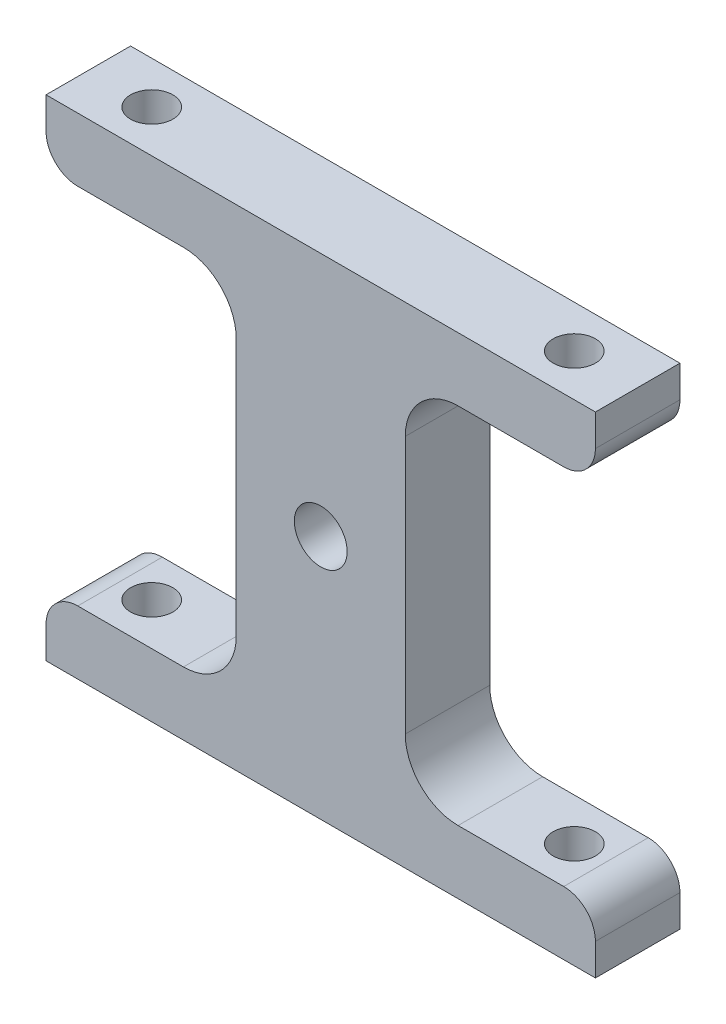
ISO-10303-21;
HEADER;
FILE_DESCRIPTION(('STEP AP214'),'2;1');
FILE_NAME('part.step','',(''),(''),'','','');
FILE_SCHEMA(('AUTOMOTIVE_DESIGN { 1 0 10303 214 1 1 1 1 }'));
ENDSEC;
DATA;
#1=APPLICATION_CONTEXT('core data for automotive mechanical design processes');
#2=APPLICATION_PROTOCOL_DEFINITION('international standard','automotive_design',2000,#1);
#3=PRODUCT_CONTEXT('',#1,'mechanical');
#4=PRODUCT('Part','Part','',(#3));
#5=PRODUCT_RELATED_PRODUCT_CATEGORY('part','',(#4));
#6=PRODUCT_DEFINITION_FORMATION('','',#4);
#7=PRODUCT_DEFINITION_CONTEXT('part definition',#1,'design');
#8=PRODUCT_DEFINITION('design','',#6,#7);
#9=PRODUCT_DEFINITION_SHAPE('','',#8);
#10=(LENGTH_UNIT() NAMED_UNIT(*) SI_UNIT(.MILLI.,.METRE.));
#11=(NAMED_UNIT(*) PLANE_ANGLE_UNIT() SI_UNIT($,.RADIAN.));
#12=(NAMED_UNIT(*) SI_UNIT($,.STERADIAN.) SOLID_ANGLE_UNIT());
#13=UNCERTAINTY_MEASURE_WITH_UNIT(LENGTH_MEASURE(1.E-05),#10,'distance_accuracy_value','');
#14=(GEOMETRIC_REPRESENTATION_CONTEXT(3) GLOBAL_UNCERTAINTY_ASSIGNED_CONTEXT((#13)) GLOBAL_UNIT_ASSIGNED_CONTEXT((#10,
#11,#12)) REPRESENTATION_CONTEXT('',''));
#15=CARTESIAN_POINT('',(0.,0.,0.));
#16=DIRECTION('',(0.,0.,1.));
#17=DIRECTION('',(1.,0.,0.));
#18=AXIS2_PLACEMENT_3D('',#15,#16,#17);
#19=CARTESIAN_POINT('',(0.,0.,8.));
#20=DIRECTION('',(0.,0.,-1.));
#21=DIRECTION('',(-1.,0.,0.));
#22=AXIS2_PLACEMENT_3D('',#19,#20,#21);
#23=PLANE('',#22);
#24=DIRECTION('',(0.,1.,0.));
#25=VECTOR('',#24,1.);
#26=CARTESIAN_POINT('',(26.,-23.2,8.));
#27=LINE('',#26,#25);
#28=CARTESIAN_POINT('',(26.,-23.2,8.));
#29=VERTEX_POINT('',#28);
#30=CARTESIAN_POINT('',(26.,-20.2,8.));
#31=VERTEX_POINT('',#30);
#32=EDGE_CURVE('E205',#29,#31,#27,.T.);
#33=ORIENTED_EDGE('',*,*,#32,.T.);
#34=CARTESIAN_POINT('',(23.,-20.2,8.));
#35=DIRECTION('',(0.,0.,-1.));
#36=DIRECTION('',(-1.,0.,0.));
#37=AXIS2_PLACEMENT_3D('',#34,#35,#36);
#38=CIRCLE('',#37,3.);
#39=CARTESIAN_POINT('',(23.,-17.2,8.));
#40=VERTEX_POINT('',#39);
#41=EDGE_CURVE('E279',#31,#40,#38,.F.);
#42=ORIENTED_EDGE('',*,*,#41,.T.);
#43=DIRECTION('',(-1.,0.,0.));
#44=VECTOR('',#43,1.);
#45=CARTESIAN_POINT('',(26.,-17.2,8.));
#46=LINE('',#45,#44);
#47=CARTESIAN_POINT('',(13.,-17.2,8.));
#48=VERTEX_POINT('',#47);
#49=EDGE_CURVE('E204',#40,#48,#46,.T.);
#50=ORIENTED_EDGE('',*,*,#49,.T.);
#51=CARTESIAN_POINT('',(13.,-12.2,8.));
#52=DIRECTION('',(0.,0.,-1.));
#53=DIRECTION('',(-1.,0.,0.));
#54=AXIS2_PLACEMENT_3D('',#51,#52,#53);
#55=CIRCLE('',#54,5.);
#56=CARTESIAN_POINT('',(8.,-12.2,8.));
#57=VERTEX_POINT('',#56);
#58=EDGE_CURVE('E321',#48,#57,#55,.T.);
#59=ORIENTED_EDGE('',*,*,#58,.T.);
#60=DIRECTION('',(0.,1.,0.));
#61=VECTOR('',#60,1.);
#62=CARTESIAN_POINT('',(8.,17.2,8.));
#63=LINE('',#62,#61);
#64=CARTESIAN_POINT('',(8.,12.2,8.));
#65=VERTEX_POINT('',#64);
#66=EDGE_CURVE('E209',#57,#65,#63,.T.);
#67=ORIENTED_EDGE('',*,*,#66,.T.);
#68=CARTESIAN_POINT('',(13.,12.2,8.));
#69=DIRECTION('',(0.,0.,-1.));
#70=DIRECTION('',(-1.,0.,0.));
#71=AXIS2_PLACEMENT_3D('',#68,#69,#70);
#72=CIRCLE('',#71,5.);
#73=CARTESIAN_POINT('',(13.,17.2,8.));
#74=VERTEX_POINT('',#73);
#75=EDGE_CURVE('E324',#65,#74,#72,.T.);
#76=ORIENTED_EDGE('',*,*,#75,.T.);
#77=DIRECTION('',(1.,0.,0.));
#78=VECTOR('',#77,1.);
#79=CARTESIAN_POINT('',(26.,17.2,8.));
#80=LINE('',#79,#78);
#81=CARTESIAN_POINT('',(23.,17.2,8.));
#82=VERTEX_POINT('',#81);
#83=EDGE_CURVE('E213',#74,#82,#80,.T.);
#84=ORIENTED_EDGE('',*,*,#83,.T.);
#85=CARTESIAN_POINT('',(23.,20.2,8.));
#86=DIRECTION('',(0.,0.,-1.));
#87=DIRECTION('',(-1.,0.,0.));
#88=AXIS2_PLACEMENT_3D('',#85,#86,#87);
#89=CIRCLE('',#88,3.);
#90=CARTESIAN_POINT('',(26.,20.2,8.));
#91=VERTEX_POINT('',#90);
#92=EDGE_CURVE('E274',#82,#91,#89,.F.);
#93=ORIENTED_EDGE('',*,*,#92,.T.);
#94=DIRECTION('',(0.,1.,0.));
#95=VECTOR('',#94,1.);
#96=CARTESIAN_POINT('',(26.,23.2,8.));
#97=LINE('',#96,#95);
#98=CARTESIAN_POINT('',(26.,23.2,8.));
#99=VERTEX_POINT('',#98);
#100=EDGE_CURVE('E214',#91,#99,#97,.T.);
#101=ORIENTED_EDGE('',*,*,#100,.T.);
#102=DIRECTION('',(-1.,0.,0.));
#103=VECTOR('',#102,1.);
#104=CARTESIAN_POINT('',(-26.,23.2,8.));
#105=LINE('',#104,#103);
#106=CARTESIAN_POINT('',(-26.,23.2,8.));
#107=VERTEX_POINT('',#106);
#108=EDGE_CURVE('E220',#99,#107,#105,.T.);
#109=ORIENTED_EDGE('',*,*,#108,.T.);
#110=DIRECTION('',(0.,-1.,0.));
#111=VECTOR('',#110,1.);
#112=CARTESIAN_POINT('',(-26.,17.2,8.));
#113=LINE('',#112,#111);
#114=CARTESIAN_POINT('',(-26.,20.2,8.));
#115=VERTEX_POINT('',#114);
#116=EDGE_CURVE('E218',#107,#115,#113,.T.);
#117=ORIENTED_EDGE('',*,*,#116,.T.);
#118=CARTESIAN_POINT('',(-23.,20.2,8.));
#119=DIRECTION('',(0.,0.,-1.));
#120=DIRECTION('',(-1.,0.,0.));
#121=AXIS2_PLACEMENT_3D('',#118,#119,#120);
#122=CIRCLE('',#121,3.);
#123=CARTESIAN_POINT('',(-23.,17.2,8.));
#124=VERTEX_POINT('',#123);
#125=EDGE_CURVE('E272',#115,#124,#122,.F.);
#126=ORIENTED_EDGE('',*,*,#125,.T.);
#127=DIRECTION('',(1.,0.,0.));
#128=VECTOR('',#127,1.);
#129=CARTESIAN_POINT('',(-8.00000000000001,17.2,8.));
#130=LINE('',#129,#128);
#131=CARTESIAN_POINT('',(-13.,17.2,8.));
#132=VERTEX_POINT('',#131);
#133=EDGE_CURVE('E252',#124,#132,#130,.T.);
#134=ORIENTED_EDGE('',*,*,#133,.T.);
#135=CARTESIAN_POINT('',(-13.,12.2,8.));
#136=DIRECTION('',(0.,0.,-1.));
#137=DIRECTION('',(-1.,0.,0.));
#138=AXIS2_PLACEMENT_3D('',#135,#136,#137);
#139=CIRCLE('',#138,5.);
#140=CARTESIAN_POINT('',(-8.00000000000001,12.2,8.));
#141=VERTEX_POINT('',#140);
#142=EDGE_CURVE('E11',#132,#141,#139,.T.);
#143=ORIENTED_EDGE('',*,*,#142,.T.);
#144=DIRECTION('',(0.,-1.,0.));
#145=VECTOR('',#144,1.);
#146=CARTESIAN_POINT('',(-8.,-17.2,8.));
#147=LINE('',#146,#145);
#148=CARTESIAN_POINT('',(-8.,-12.2,8.));
#149=VERTEX_POINT('',#148);
#150=EDGE_CURVE('E445',#141,#149,#147,.T.);
#151=ORIENTED_EDGE('',*,*,#150,.T.);
#152=CARTESIAN_POINT('',(-13.,-12.2,8.));
#153=DIRECTION('',(0.,0.,-1.));
#154=DIRECTION('',(-1.,0.,0.));
#155=AXIS2_PLACEMENT_3D('',#152,#153,#154);
#156=CIRCLE('',#155,5.);
#157=CARTESIAN_POINT('',(-13.,-17.2,8.));
#158=VERTEX_POINT('',#157);
#159=EDGE_CURVE('E320',#149,#158,#156,.T.);
#160=ORIENTED_EDGE('',*,*,#159,.T.);
#161=DIRECTION('',(-1.,0.,0.));
#162=VECTOR('',#161,1.);
#163=CARTESIAN_POINT('',(-8.,-17.2,8.));
#164=LINE('',#163,#162);
#165=CARTESIAN_POINT('',(-23.,-17.2,8.));
#166=VERTEX_POINT('',#165);
#167=EDGE_CURVE('E189',#158,#166,#164,.T.);
#168=ORIENTED_EDGE('',*,*,#167,.T.);
#169=CARTESIAN_POINT('',(-23.,-20.2,8.));
#170=DIRECTION('',(0.,0.,-1.));
#171=DIRECTION('',(-1.,0.,0.));
#172=AXIS2_PLACEMENT_3D('',#169,#170,#171);
#173=CIRCLE('',#172,3.);
#174=CARTESIAN_POINT('',(-26.,-20.2,8.));
#175=VERTEX_POINT('',#174);
#176=EDGE_CURVE('E181',#166,#175,#173,.F.);
#177=ORIENTED_EDGE('',*,*,#176,.T.);
#178=DIRECTION('',(0.,-1.,0.));
#179=VECTOR('',#178,1.);
#180=CARTESIAN_POINT('',(-26.,-17.2,8.));
#181=LINE('',#180,#179);
#182=CARTESIAN_POINT('',(-26.,-23.2,8.));
#183=VERTEX_POINT('',#182);
#184=EDGE_CURVE('E171',#175,#183,#181,.T.);
#185=ORIENTED_EDGE('',*,*,#184,.T.);
#186=DIRECTION('',(1.,0.,0.));
#187=VECTOR('',#186,1.);
#188=CARTESIAN_POINT('',(-26.,-23.2,8.));
#189=LINE('',#188,#187);
#190=EDGE_CURVE('E176',#183,#29,#189,.T.);
#191=ORIENTED_EDGE('',*,*,#190,.T.);
#192=EDGE_LOOP('',(#33,#42,#50,#59,#67,#76,#84,#93,#101,#109,#117,#126,#134,#143,#151,#160,#168,
#177,#185,#191));
#193=FACE_BOUND('',#192,.T.);
#194=CARTESIAN_POINT('',(0.,0.,8.));
#195=DIRECTION('',(0.,0.,1.));
#196=DIRECTION('',(1.,0.,0.));
#197=AXIS2_PLACEMENT_3D('',#194,#195,#196);
#198=CIRCLE('',#197,2.5);
#199=CARTESIAN_POINT('',(2.5,0.,8.));
#200=VERTEX_POINT('',#199);
#201=EDGE_CURVE('E228',#200,#200,#198,.T.);
#202=ORIENTED_EDGE('',*,*,#201,.F.);
#203=EDGE_LOOP('',(#202));
#204=FACE_BOUND('',#203,.T.);
#205=ADVANCED_FACE('F39',(#193,#204),#23,.F.);
#206=CARTESIAN_POINT('',(0.,0.,0.));
#207=DIRECTION('',(0.,0.,-1.));
#208=DIRECTION('',(-1.,0.,0.));
#209=AXIS2_PLACEMENT_3D('',#206,#207,#208);
#210=PLANE('',#209);
#211=DIRECTION('',(-1.,0.,0.));
#212=VECTOR('',#211,1.);
#213=CARTESIAN_POINT('',(26.,-17.2,0.));
#214=LINE('',#213,#212);
#215=CARTESIAN_POINT('',(23.,-17.2,0.));
#216=VERTEX_POINT('',#215);
#217=CARTESIAN_POINT('',(13.,-17.2,0.));
#218=VERTEX_POINT('',#217);
#219=EDGE_CURVE('E240',#216,#218,#214,.T.);
#220=ORIENTED_EDGE('',*,*,#219,.F.);
#221=CARTESIAN_POINT('',(23.,-20.2,0.));
#222=DIRECTION('',(0.,0.,-1.));
#223=DIRECTION('',(-1.,0.,0.));
#224=AXIS2_PLACEMENT_3D('',#221,#222,#223);
#225=CIRCLE('',#224,3.);
#226=CARTESIAN_POINT('',(26.,-20.2,0.));
#227=VERTEX_POINT('',#226);
#228=EDGE_CURVE('E267',#216,#227,#225,.T.);
#229=ORIENTED_EDGE('',*,*,#228,.T.);
#230=DIRECTION('',(0.,1.,0.));
#231=VECTOR('',#230,1.);
#232=CARTESIAN_POINT('',(26.,-23.2,0.));
#233=LINE('',#232,#231);
#234=CARTESIAN_POINT('',(26.,-23.2,0.));
#235=VERTEX_POINT('',#234);
#236=EDGE_CURVE('E234',#235,#227,#233,.T.);
#237=ORIENTED_EDGE('',*,*,#236,.F.);
#238=DIRECTION('',(1.,0.,0.));
#239=VECTOR('',#238,1.);
#240=CARTESIAN_POINT('',(-26.,-23.2,0.));
#241=LINE('',#240,#239);
#242=CARTESIAN_POINT('',(-26.,-23.2,0.));
#243=VERTEX_POINT('',#242);
#244=EDGE_CURVE('E235',#243,#235,#241,.T.);
#245=ORIENTED_EDGE('',*,*,#244,.F.);
#246=DIRECTION('',(0.,-1.,0.));
#247=VECTOR('',#246,1.);
#248=CARTESIAN_POINT('',(-26.,-17.2,0.));
#249=LINE('',#248,#247);
#250=CARTESIAN_POINT('',(-26.,-20.2,0.));
#251=VERTEX_POINT('',#250);
#252=EDGE_CURVE('E193',#251,#243,#249,.T.);
#253=ORIENTED_EDGE('',*,*,#252,.F.);
#254=CARTESIAN_POINT('',(-23.,-20.2,0.));
#255=DIRECTION('',(0.,0.,-1.));
#256=DIRECTION('',(-1.,0.,0.));
#257=AXIS2_PLACEMENT_3D('',#254,#255,#256);
#258=CIRCLE('',#257,3.);
#259=CARTESIAN_POINT('',(-23.,-17.2,0.));
#260=VERTEX_POINT('',#259);
#261=EDGE_CURVE('E266',#251,#260,#258,.T.);
#262=ORIENTED_EDGE('',*,*,#261,.T.);
#263=DIRECTION('',(-1.,0.,0.));
#264=VECTOR('',#263,1.);
#265=CARTESIAN_POINT('',(-8.,-17.2,0.));
#266=LINE('',#265,#264);
#267=CARTESIAN_POINT('',(-13.,-17.2,0.));
#268=VERTEX_POINT('',#267);
#269=EDGE_CURVE('E230',#268,#260,#266,.T.);
#270=ORIENTED_EDGE('',*,*,#269,.F.);
#271=CARTESIAN_POINT('',(-13.,-12.2,0.));
#272=DIRECTION('',(0.,0.,-1.));
#273=DIRECTION('',(-1.,0.,0.));
#274=AXIS2_PLACEMENT_3D('',#271,#272,#273);
#275=CIRCLE('',#274,5.);
#276=CARTESIAN_POINT('',(-8.,-12.2,0.));
#277=VERTEX_POINT('',#276);
#278=EDGE_CURVE('E312',#268,#277,#275,.F.);
#279=ORIENTED_EDGE('',*,*,#278,.T.);
#280=DIRECTION('',(0.,-1.,0.));
#281=VECTOR('',#280,1.);
#282=CARTESIAN_POINT('',(-8.,-17.2,0.));
#283=LINE('',#282,#281);
#284=CARTESIAN_POINT('',(-8.00000000000001,12.2,0.));
#285=VERTEX_POINT('',#284);
#286=EDGE_CURVE('E223',#285,#277,#283,.T.);
#287=ORIENTED_EDGE('',*,*,#286,.F.);
#288=CARTESIAN_POINT('',(-13.,12.2,0.));
#289=DIRECTION('',(0.,0.,-1.));
#290=DIRECTION('',(-1.,0.,0.));
#291=AXIS2_PLACEMENT_3D('',#288,#289,#290);
#292=CIRCLE('',#291,5.);
#293=CARTESIAN_POINT('',(-13.,17.2,0.));
#294=VERTEX_POINT('',#293);
#295=EDGE_CURVE('E50',#285,#294,#292,.F.);
#296=ORIENTED_EDGE('',*,*,#295,.T.);
#297=DIRECTION('',(1.,0.,0.));
#298=VECTOR('',#297,1.);
#299=CARTESIAN_POINT('',(-8.00000000000001,17.2,0.));
#300=LINE('',#299,#298);
#301=CARTESIAN_POINT('',(-23.,17.2,0.));
#302=VERTEX_POINT('',#301);
#303=EDGE_CURVE('E224',#302,#294,#300,.T.);
#304=ORIENTED_EDGE('',*,*,#303,.F.);
#305=CARTESIAN_POINT('',(-23.,20.2,0.));
#306=DIRECTION('',(0.,0.,-1.));
#307=DIRECTION('',(-1.,0.,0.));
#308=AXIS2_PLACEMENT_3D('',#305,#306,#307);
#309=CIRCLE('',#308,3.);
#310=CARTESIAN_POINT('',(-26.,20.2,0.));
#311=VERTEX_POINT('',#310);
#312=EDGE_CURVE('E261',#302,#311,#309,.T.);
#313=ORIENTED_EDGE('',*,*,#312,.T.);
#314=DIRECTION('',(0.,-1.,0.));
#315=VECTOR('',#314,1.);
#316=CARTESIAN_POINT('',(-26.,17.2,0.));
#317=LINE('',#316,#315);
#318=CARTESIAN_POINT('',(-26.,23.2,0.));
#319=VERTEX_POINT('',#318);
#320=EDGE_CURVE('E249',#319,#311,#317,.T.);
#321=ORIENTED_EDGE('',*,*,#320,.F.);
#322=DIRECTION('',(-1.,0.,0.));
#323=VECTOR('',#322,1.);
#324=CARTESIAN_POINT('',(-26.,23.2,0.));
#325=LINE('',#324,#323);
#326=CARTESIAN_POINT('',(26.,23.2,0.));
#327=VERTEX_POINT('',#326);
#328=EDGE_CURVE('E250',#327,#319,#325,.T.);
#329=ORIENTED_EDGE('',*,*,#328,.F.);
#330=DIRECTION('',(0.,1.,0.));
#331=VECTOR('',#330,1.);
#332=CARTESIAN_POINT('',(26.,23.2,0.));
#333=LINE('',#332,#331);
#334=CARTESIAN_POINT('',(26.,20.2,0.));
#335=VERTEX_POINT('',#334);
#336=EDGE_CURVE('E241',#335,#327,#333,.T.);
#337=ORIENTED_EDGE('',*,*,#336,.F.);
#338=CARTESIAN_POINT('',(23.,20.2,0.));
#339=DIRECTION('',(0.,0.,-1.));
#340=DIRECTION('',(-1.,0.,0.));
#341=AXIS2_PLACEMENT_3D('',#338,#339,#340);
#342=CIRCLE('',#341,3.);
#343=CARTESIAN_POINT('',(23.,17.2,0.));
#344=VERTEX_POINT('',#343);
#345=EDGE_CURVE('E263',#335,#344,#342,.T.);
#346=ORIENTED_EDGE('',*,*,#345,.T.);
#347=DIRECTION('',(1.,0.,0.));
#348=VECTOR('',#347,1.);
#349=CARTESIAN_POINT('',(26.,17.2,0.));
#350=LINE('',#349,#348);
#351=CARTESIAN_POINT('',(13.,17.2,0.));
#352=VERTEX_POINT('',#351);
#353=EDGE_CURVE('E242',#352,#344,#350,.T.);
#354=ORIENTED_EDGE('',*,*,#353,.F.);
#355=CARTESIAN_POINT('',(13.,12.2,0.));
#356=DIRECTION('',(0.,0.,-1.));
#357=DIRECTION('',(-1.,0.,0.));
#358=AXIS2_PLACEMENT_3D('',#355,#356,#357);
#359=CIRCLE('',#358,5.);
#360=CARTESIAN_POINT('',(8.,12.2,0.));
#361=VERTEX_POINT('',#360);
#362=EDGE_CURVE('E323',#352,#361,#359,.F.);
#363=ORIENTED_EDGE('',*,*,#362,.T.);
#364=DIRECTION('',(0.,1.,0.));
#365=VECTOR('',#364,1.);
#366=CARTESIAN_POINT('',(8.,17.2,0.));
#367=LINE('',#366,#365);
#368=CARTESIAN_POINT('',(8.,-12.2,0.));
#369=VERTEX_POINT('',#368);
#370=EDGE_CURVE('E238',#369,#361,#367,.T.);
#371=ORIENTED_EDGE('',*,*,#370,.F.);
#372=CARTESIAN_POINT('',(13.,-12.2,0.));
#373=DIRECTION('',(0.,0.,-1.));
#374=DIRECTION('',(-1.,0.,0.));
#375=AXIS2_PLACEMENT_3D('',#372,#373,#374);
#376=CIRCLE('',#375,5.);
#377=EDGE_CURVE('E317',#369,#218,#376,.F.);
#378=ORIENTED_EDGE('',*,*,#377,.T.);
#379=EDGE_LOOP('',(#220,#229,#237,#245,#253,#262,#270,#279,#287,#296,#304,#313,#321,#329,#337,
#346,#354,#363,#371,#378));
#380=FACE_BOUND('',#379,.T.);
#381=CARTESIAN_POINT('',(0.,0.,0.));
#382=DIRECTION('',(0.,0.,1.));
#383=DIRECTION('',(1.,0.,0.));
#384=AXIS2_PLACEMENT_3D('',#381,#382,#383);
#385=CIRCLE('',#384,2.5);
#386=CARTESIAN_POINT('',(2.5,0.,0.));
#387=VERTEX_POINT('',#386);
#388=EDGE_CURVE('E446',#387,#387,#385,.T.);
#389=ORIENTED_EDGE('',*,*,#388,.T.);
#390=EDGE_LOOP('',(#389));
#391=FACE_BOUND('',#390,.T.);
#392=ADVANCED_FACE('F336',(#380,#391),#210,.T.);
#393=CARTESIAN_POINT('',(-8.00000000000001,17.2,8.));
#394=DIRECTION('',(0.,1.,0.));
#395=DIRECTION('',(-1.,0.,0.));
#396=AXIS2_PLACEMENT_3D('',#393,#394,#395);
#397=PLANE('',#396);
#398=CARTESIAN_POINT('',(-20.,17.2,4.));
#399=DIRECTION('',(0.,1.,0.));
#400=DIRECTION('',(-1.,0.,0.));
#401=AXIS2_PLACEMENT_3D('',#398,#399,#400);
#402=CIRCLE('',#401,2.);
#403=CARTESIAN_POINT('',(-22.,17.2,4.));
#404=VERTEX_POINT('',#403);
#405=EDGE_CURVE('E453',#404,#404,#402,.T.);
#406=ORIENTED_EDGE('',*,*,#405,.T.);
#407=EDGE_LOOP('',(#406));
#408=FACE_BOUND('',#407,.T.);
#409=ORIENTED_EDGE('',*,*,#303,.T.);
#410=DIRECTION('',(0.,0.,-1.));
#411=VECTOR('',#410,1.);
#412=CARTESIAN_POINT('',(-13.,17.2,8.));
#413=LINE('',#412,#411);
#414=EDGE_CURVE('E58',#294,#132,#413,.F.);
#415=ORIENTED_EDGE('',*,*,#414,.T.);
#416=ORIENTED_EDGE('',*,*,#133,.F.);
#417=DIRECTION('',(0.,0.,-1.));
#418=VECTOR('',#417,1.);
#419=CARTESIAN_POINT('',(-23.,17.2,8.));
#420=LINE('',#419,#418);
#421=EDGE_CURVE('E292',#124,#302,#420,.T.);
#422=ORIENTED_EDGE('',*,*,#421,.T.);
#423=EDGE_LOOP('',(#409,#415,#416,#422));
#424=FACE_BOUND('',#423,.T.);
#425=ADVANCED_FACE('F378',(#408,#424),#397,.F.);
#426=CARTESIAN_POINT('',(-8.,-17.2,8.));
#427=DIRECTION('',(1.,0.,0.));
#428=DIRECTION('',(0.,1.,0.));
#429=AXIS2_PLACEMENT_3D('',#426,#427,#428);
#430=PLANE('',#429);
#431=ORIENTED_EDGE('',*,*,#286,.T.);
#432=DIRECTION('',(0.,0.,-1.));
#433=VECTOR('',#432,1.);
#434=CARTESIAN_POINT('',(-8.,-12.2,8.));
#435=LINE('',#434,#433);
#436=EDGE_CURVE('E305',#277,#149,#435,.F.);
#437=ORIENTED_EDGE('',*,*,#436,.T.);
#438=ORIENTED_EDGE('',*,*,#150,.F.);
#439=DIRECTION('',(0.,0.,-1.));
#440=VECTOR('',#439,1.);
#441=CARTESIAN_POINT('',(-8.,12.2,0.));
#442=LINE('',#441,#440);
#443=EDGE_CURVE('E300',#141,#285,#442,.T.);
#444=ORIENTED_EDGE('',*,*,#443,.T.);
#445=EDGE_LOOP('',(#431,#437,#438,#444));
#446=FACE_BOUND('',#445,.T.);
#447=ADVANCED_FACE('F443',(#446),#430,.F.);
#448=CARTESIAN_POINT('',(-8.,-17.2,8.));
#449=DIRECTION('',(0.,-1.,0.));
#450=DIRECTION('',(1.,0.,0.));
#451=AXIS2_PLACEMENT_3D('',#448,#449,#450);
#452=PLANE('',#451);
#453=CARTESIAN_POINT('',(-20.,-17.2,4.));
#454=DIRECTION('',(0.,-1.,0.));
#455=DIRECTION('',(1.,0.,0.));
#456=AXIS2_PLACEMENT_3D('',#453,#454,#455);
#457=CIRCLE('',#456,2.);
#458=CARTESIAN_POINT('',(-18.,-17.2,4.));
#459=VERTEX_POINT('',#458);
#460=EDGE_CURVE('E456',#459,#459,#457,.T.);
#461=ORIENTED_EDGE('',*,*,#460,.T.);
#462=EDGE_LOOP('',(#461));
#463=FACE_BOUND('',#462,.T.);
#464=ORIENTED_EDGE('',*,*,#167,.F.);
#465=DIRECTION('',(0.,0.,-1.));
#466=VECTOR('',#465,1.);
#467=CARTESIAN_POINT('',(-13.,-17.2,0.));
#468=LINE('',#467,#466);
#469=EDGE_CURVE('E298',#158,#268,#468,.T.);
#470=ORIENTED_EDGE('',*,*,#469,.T.);
#471=ORIENTED_EDGE('',*,*,#269,.T.);
#472=DIRECTION('',(0.,0.,-1.));
#473=VECTOR('',#472,1.);
#474=CARTESIAN_POINT('',(-23.,-17.2,8.));
#475=LINE('',#474,#473);
#476=EDGE_CURVE('E284',#260,#166,#475,.F.);
#477=ORIENTED_EDGE('',*,*,#476,.T.);
#478=EDGE_LOOP('',(#464,#470,#471,#477));
#479=FACE_BOUND('',#478,.T.);
#480=ADVANCED_FACE('F487',(#463,#479),#452,.F.);
#481=CARTESIAN_POINT('',(-26.,-17.2,8.));
#482=DIRECTION('',(1.,0.,0.));
#483=DIRECTION('',(0.,1.,0.));
#484=AXIS2_PLACEMENT_3D('',#481,#482,#483);
#485=PLANE('',#484);
#486=ORIENTED_EDGE('',*,*,#184,.F.);
#487=DIRECTION('',(0.,0.,-1.));
#488=VECTOR('',#487,1.);
#489=CARTESIAN_POINT('',(-26.,-20.2,8.));
#490=LINE('',#489,#488);
#491=EDGE_CURVE('E278',#175,#251,#490,.T.);
#492=ORIENTED_EDGE('',*,*,#491,.T.);
#493=ORIENTED_EDGE('',*,*,#252,.T.);
#494=DIRECTION('',(0.,0.,-1.));
#495=VECTOR('',#494,1.);
#496=CARTESIAN_POINT('',(-26.,-23.2,8.));
#497=LINE('',#496,#495);
#498=EDGE_CURVE('E186',#183,#243,#497,.T.);
#499=ORIENTED_EDGE('',*,*,#498,.F.);
#500=EDGE_LOOP('',(#486,#492,#493,#499));
#501=FACE_BOUND('',#500,.T.);
#502=ADVANCED_FACE('F192',(#501),#485,.F.);
#503=CARTESIAN_POINT('',(-26.,-23.2,8.));
#504=DIRECTION('',(0.,1.,0.));
#505=DIRECTION('',(0.,0.,1.));
#506=AXIS2_PLACEMENT_3D('',#503,#504,#505);
#507=PLANE('',#506);
#508=CARTESIAN_POINT('',(-20.,-23.2,4.));
#509=DIRECTION('',(0.,1.,0.));
#510=DIRECTION('',(0.,0.,1.));
#511=AXIS2_PLACEMENT_3D('',#508,#509,#510);
#512=CIRCLE('',#511,2.);
#513=CARTESIAN_POINT('',(-20.,-23.2,6.));
#514=VERTEX_POINT('',#513);
#515=EDGE_CURVE('E470',#514,#514,#512,.T.);
#516=ORIENTED_EDGE('',*,*,#515,.T.);
#517=EDGE_LOOP('',(#516));
#518=FACE_BOUND('',#517,.T.);
#519=CARTESIAN_POINT('',(20.,-23.2,4.));
#520=DIRECTION('',(0.,1.,0.));
#521=DIRECTION('',(0.,0.,1.));
#522=AXIS2_PLACEMENT_3D('',#519,#520,#521);
#523=CIRCLE('',#522,2.);
#524=CARTESIAN_POINT('',(20.,-23.2,6.));
#525=VERTEX_POINT('',#524);
#526=EDGE_CURVE('E473',#525,#525,#523,.T.);
#527=ORIENTED_EDGE('',*,*,#526,.T.);
#528=EDGE_LOOP('',(#527));
#529=FACE_BOUND('',#528,.T.);
#530=ORIENTED_EDGE('',*,*,#244,.T.);
#531=DIRECTION('',(0.,0.,-1.));
#532=VECTOR('',#531,1.);
#533=CARTESIAN_POINT('',(26.,-23.2,8.));
#534=LINE('',#533,#532);
#535=EDGE_CURVE('E197',#29,#235,#534,.T.);
#536=ORIENTED_EDGE('',*,*,#535,.F.);
#537=ORIENTED_EDGE('',*,*,#190,.F.);
#538=ORIENTED_EDGE('',*,*,#498,.T.);
#539=EDGE_LOOP('',(#530,#536,#537,#538));
#540=FACE_BOUND('',#539,.T.);
#541=ADVANCED_FACE('F200',(#518,#529,#540),#507,.F.);
#542=CARTESIAN_POINT('',(26.,-23.2,8.));
#543=DIRECTION('',(-1.,0.,0.));
#544=DIRECTION('',(0.,0.,1.));
#545=AXIS2_PLACEMENT_3D('',#542,#543,#544);
#546=PLANE('',#545);
#547=ORIENTED_EDGE('',*,*,#236,.T.);
#548=DIRECTION('',(0.,0.,-1.));
#549=VECTOR('',#548,1.);
#550=CARTESIAN_POINT('',(26.,-20.2,8.));
#551=LINE('',#550,#549);
#552=EDGE_CURVE('E271',#227,#31,#551,.F.);
#553=ORIENTED_EDGE('',*,*,#552,.T.);
#554=ORIENTED_EDGE('',*,*,#32,.F.);
#555=ORIENTED_EDGE('',*,*,#535,.T.);
#556=EDGE_LOOP('',(#547,#553,#554,#555));
#557=FACE_BOUND('',#556,.T.);
#558=ADVANCED_FACE('F359',(#557),#546,.F.);
#559=CARTESIAN_POINT('',(26.,-17.2,8.));
#560=DIRECTION('',(0.,-1.,0.));
#561=DIRECTION('',(1.,0.,0.));
#562=AXIS2_PLACEMENT_3D('',#559,#560,#561);
#563=PLANE('',#562);
#564=CARTESIAN_POINT('',(20.,-17.2,4.));
#565=DIRECTION('',(0.,-1.,0.));
#566=DIRECTION('',(1.,0.,0.));
#567=AXIS2_PLACEMENT_3D('',#564,#565,#566);
#568=CIRCLE('',#567,2.);
#569=CARTESIAN_POINT('',(22.,-17.2,4.));
#570=VERTEX_POINT('',#569);
#571=EDGE_CURVE('E463',#570,#570,#568,.T.);
#572=ORIENTED_EDGE('',*,*,#571,.T.);
#573=EDGE_LOOP('',(#572));
#574=FACE_BOUND('',#573,.T.);
#575=ORIENTED_EDGE('',*,*,#219,.T.);
#576=DIRECTION('',(0.,0.,-1.));
#577=VECTOR('',#576,1.);
#578=CARTESIAN_POINT('',(13.,-17.2,8.));
#579=LINE('',#578,#577);
#580=EDGE_CURVE('E310',#218,#48,#579,.F.);
#581=ORIENTED_EDGE('',*,*,#580,.T.);
#582=ORIENTED_EDGE('',*,*,#49,.F.);
#583=DIRECTION('',(0.,0.,-1.));
#584=VECTOR('',#583,1.);
#585=CARTESIAN_POINT('',(23.,-17.2,8.));
#586=LINE('',#585,#584);
#587=EDGE_CURVE('E198',#40,#216,#586,.T.);
#588=ORIENTED_EDGE('',*,*,#587,.T.);
#589=EDGE_LOOP('',(#575,#581,#582,#588));
#590=FACE_BOUND('',#589,.T.);
#591=ADVANCED_FACE('F348',(#574,#590),#563,.F.);
#592=CARTESIAN_POINT('',(8.,17.2,8.));
#593=DIRECTION('',(-1.,0.,0.));
#594=DIRECTION('',(0.,-1.,0.));
#595=AXIS2_PLACEMENT_3D('',#592,#593,#594);
#596=PLANE('',#595);
#597=ORIENTED_EDGE('',*,*,#66,.F.);
#598=DIRECTION('',(0.,0.,-1.));
#599=VECTOR('',#598,1.);
#600=CARTESIAN_POINT('',(8.,-12.2,0.));
#601=LINE('',#600,#599);
#602=EDGE_CURVE('E308',#57,#369,#601,.T.);
#603=ORIENTED_EDGE('',*,*,#602,.T.);
#604=ORIENTED_EDGE('',*,*,#370,.T.);
#605=DIRECTION('',(0.,0.,-1.));
#606=VECTOR('',#605,1.);
#607=CARTESIAN_POINT('',(8.,12.2,8.));
#608=LINE('',#607,#606);
#609=EDGE_CURVE('E304',#361,#65,#608,.F.);
#610=ORIENTED_EDGE('',*,*,#609,.T.);
#611=EDGE_LOOP('',(#597,#603,#604,#610));
#612=FACE_BOUND('',#611,.T.);
#613=ADVANCED_FACE('F343',(#612),#596,.F.);
#614=CARTESIAN_POINT('',(26.,17.2,8.));
#615=DIRECTION('',(0.,1.,0.));
#616=DIRECTION('',(-1.,0.,0.));
#617=AXIS2_PLACEMENT_3D('',#614,#615,#616);
#618=PLANE('',#617);
#619=CARTESIAN_POINT('',(20.,17.2,4.));
#620=DIRECTION('',(0.,1.,0.));
#621=DIRECTION('',(-1.,0.,0.));
#622=AXIS2_PLACEMENT_3D('',#619,#620,#621);
#623=CIRCLE('',#622,2.);
#624=CARTESIAN_POINT('',(18.,17.2,4.));
#625=VERTEX_POINT('',#624);
#626=EDGE_CURVE('E465',#625,#625,#623,.T.);
#627=ORIENTED_EDGE('',*,*,#626,.T.);
#628=EDGE_LOOP('',(#627));
#629=FACE_BOUND('',#628,.T.);
#630=ORIENTED_EDGE('',*,*,#83,.F.);
#631=DIRECTION('',(0.,0.,-1.));
#632=VECTOR('',#631,1.);
#633=CARTESIAN_POINT('',(13.,17.2,0.));
#634=LINE('',#633,#632);
#635=EDGE_CURVE('E313',#74,#352,#634,.T.);
#636=ORIENTED_EDGE('',*,*,#635,.T.);
#637=ORIENTED_EDGE('',*,*,#353,.T.);
#638=DIRECTION('',(0.,0.,-1.));
#639=VECTOR('',#638,1.);
#640=CARTESIAN_POINT('',(23.,17.2,8.));
#641=LINE('',#640,#639);
#642=EDGE_CURVE('E288',#344,#82,#641,.F.);
#643=ORIENTED_EDGE('',*,*,#642,.T.);
#644=EDGE_LOOP('',(#630,#636,#637,#643));
#645=FACE_BOUND('',#644,.T.);
#646=ADVANCED_FACE('F334',(#629,#645),#618,.F.);
#647=CARTESIAN_POINT('',(26.,23.2,8.));
#648=DIRECTION('',(-1.,0.,0.));
#649=DIRECTION('',(0.,0.,1.));
#650=AXIS2_PLACEMENT_3D('',#647,#648,#649);
#651=PLANE('',#650);
#652=ORIENTED_EDGE('',*,*,#100,.F.);
#653=DIRECTION('',(0.,0.,-1.));
#654=VECTOR('',#653,1.);
#655=CARTESIAN_POINT('',(26.,20.2,8.));
#656=LINE('',#655,#654);
#657=EDGE_CURVE('E281',#91,#335,#656,.T.);
#658=ORIENTED_EDGE('',*,*,#657,.T.);
#659=ORIENTED_EDGE('',*,*,#336,.T.);
#660=DIRECTION('',(0.,0.,-1.));
#661=VECTOR('',#660,1.);
#662=CARTESIAN_POINT('',(26.,23.2,8.));
#663=LINE('',#662,#661);
#664=EDGE_CURVE('E254',#99,#327,#663,.T.);
#665=ORIENTED_EDGE('',*,*,#664,.F.);
#666=EDGE_LOOP('',(#652,#658,#659,#665));
#667=FACE_BOUND('',#666,.T.);
#668=ADVANCED_FACE('F393',(#667),#651,.F.);
#669=CARTESIAN_POINT('',(-26.,23.2,8.));
#670=DIRECTION('',(0.,-1.,0.));
#671=DIRECTION('',(0.,0.,-1.));
#672=AXIS2_PLACEMENT_3D('',#669,#670,#671);
#673=PLANE('',#672);
#674=CARTESIAN_POINT('',(-20.,23.2,4.));
#675=DIRECTION('',(0.,1.,0.));
#676=DIRECTION('',(0.,0.,1.));
#677=AXIS2_PLACEMENT_3D('',#674,#675,#676);
#678=CIRCLE('',#677,2.);
#679=CARTESIAN_POINT('',(-20.,23.2,6.));
#680=VERTEX_POINT('',#679);
#681=EDGE_CURVE('E475',#680,#680,#678,.T.);
#682=ORIENTED_EDGE('',*,*,#681,.F.);
#683=EDGE_LOOP('',(#682));
#684=FACE_BOUND('',#683,.T.);
#685=CARTESIAN_POINT('',(20.,23.2,4.));
#686=DIRECTION('',(0.,1.,0.));
#687=DIRECTION('',(0.,0.,1.));
#688=AXIS2_PLACEMENT_3D('',#685,#686,#687);
#689=CIRCLE('',#688,2.);
#690=CARTESIAN_POINT('',(20.,23.2,6.));
#691=VERTEX_POINT('',#690);
#692=EDGE_CURVE('E468',#691,#691,#689,.T.);
#693=ORIENTED_EDGE('',*,*,#692,.F.);
#694=EDGE_LOOP('',(#693));
#695=FACE_BOUND('',#694,.T.);
#696=ORIENTED_EDGE('',*,*,#328,.T.);
#697=DIRECTION('',(0.,0.,-1.));
#698=VECTOR('',#697,1.);
#699=CARTESIAN_POINT('',(-26.,23.2,8.));
#700=LINE('',#699,#698);
#701=EDGE_CURVE('E225',#107,#319,#700,.T.);
#702=ORIENTED_EDGE('',*,*,#701,.F.);
#703=ORIENTED_EDGE('',*,*,#108,.F.);
#704=ORIENTED_EDGE('',*,*,#664,.T.);
#705=EDGE_LOOP('',(#696,#702,#703,#704));
#706=FACE_BOUND('',#705,.T.);
#707=ADVANCED_FACE('F390',(#684,#695,#706),#673,.F.);
#708=CARTESIAN_POINT('',(-26.,17.2,8.));
#709=DIRECTION('',(1.,0.,0.));
#710=DIRECTION('',(0.,1.,0.));
#711=AXIS2_PLACEMENT_3D('',#708,#709,#710);
#712=PLANE('',#711);
#713=ORIENTED_EDGE('',*,*,#320,.T.);
#714=DIRECTION('',(0.,0.,-1.));
#715=VECTOR('',#714,1.);
#716=CARTESIAN_POINT('',(-26.,20.2,8.));
#717=LINE('',#716,#715);
#718=EDGE_CURVE('E294',#311,#115,#717,.F.);
#719=ORIENTED_EDGE('',*,*,#718,.T.);
#720=ORIENTED_EDGE('',*,*,#116,.F.);
#721=ORIENTED_EDGE('',*,*,#701,.T.);
#722=EDGE_LOOP('',(#713,#719,#720,#721));
#723=FACE_BOUND('',#722,.T.);
#724=ADVANCED_FACE('F383',(#723),#712,.F.);
#725=CARTESIAN_POINT('',(0.,0.,8.));
#726=DIRECTION('',(0.,0.,-1.));
#727=DIRECTION('',(-1.,0.,0.));
#728=AXIS2_PLACEMENT_3D('',#725,#726,#727);
#729=CYLINDRICAL_SURFACE('',#728,2.5);
#730=ORIENTED_EDGE('',*,*,#201,.T.);
#731=EDGE_LOOP('',(#730));
#732=FACE_BOUND('',#731,.T.);
#733=ORIENTED_EDGE('',*,*,#388,.F.);
#734=EDGE_LOOP('',(#733));
#735=FACE_BOUND('',#734,.T.);
#736=ADVANCED_FACE('F381',(#732,#735),#729,.F.);
#737=CARTESIAN_POINT('',(20.,-23.2,4.));
#738=DIRECTION('',(0.,1.,0.));
#739=DIRECTION('',(0.,0.,1.));
#740=AXIS2_PLACEMENT_3D('',#737,#738,#739);
#741=CYLINDRICAL_SURFACE('',#740,2.);
#742=ORIENTED_EDGE('',*,*,#692,.T.);
#743=EDGE_LOOP('',(#742));
#744=FACE_BOUND('',#743,.T.);
#745=ORIENTED_EDGE('',*,*,#626,.F.);
#746=EDGE_LOOP('',(#745));
#747=FACE_BOUND('',#746,.T.);
#748=ADVANCED_FACE('F547',(#744,#747),#741,.F.);
#749=CARTESIAN_POINT('',(-20.,-23.2,4.));
#750=DIRECTION('',(0.,1.,0.));
#751=DIRECTION('',(0.,0.,1.));
#752=AXIS2_PLACEMENT_3D('',#749,#750,#751);
#753=CYLINDRICAL_SURFACE('',#752,2.);
#754=ORIENTED_EDGE('',*,*,#681,.T.);
#755=EDGE_LOOP('',(#754));
#756=FACE_BOUND('',#755,.T.);
#757=ORIENTED_EDGE('',*,*,#405,.F.);
#758=EDGE_LOOP('',(#757));
#759=FACE_BOUND('',#758,.T.);
#760=ADVANCED_FACE('F486',(#756,#759),#753,.F.);
#761=ORIENTED_EDGE('',*,*,#526,.F.);
#762=EDGE_LOOP('',(#761));
#763=FACE_BOUND('',#762,.T.);
#764=ORIENTED_EDGE('',*,*,#571,.F.);
#765=EDGE_LOOP('',(#764));
#766=FACE_BOUND('',#765,.T.);
#767=ADVANCED_FACE('F482',(#763,#766),#741,.F.);
#768=ORIENTED_EDGE('',*,*,#515,.F.);
#769=EDGE_LOOP('',(#768));
#770=FACE_BOUND('',#769,.T.);
#771=ORIENTED_EDGE('',*,*,#460,.F.);
#772=EDGE_LOOP('',(#771));
#773=FACE_BOUND('',#772,.T.);
#774=ADVANCED_FACE('F481',(#770,#773),#753,.F.);
#775=CARTESIAN_POINT('',(23.,-20.2,8.));
#776=DIRECTION('',(0.,0.,-1.));
#777=DIRECTION('',(-1.,0.,0.));
#778=AXIS2_PLACEMENT_3D('',#775,#776,#777);
#779=CYLINDRICAL_SURFACE('',#778,3.);
#780=ORIENTED_EDGE('',*,*,#41,.F.);
#781=ORIENTED_EDGE('',*,*,#552,.F.);
#782=ORIENTED_EDGE('',*,*,#228,.F.);
#783=ORIENTED_EDGE('',*,*,#587,.F.);
#784=EDGE_LOOP('',(#780,#781,#782,#783));
#785=FACE_BOUND('',#784,.T.);
#786=ADVANCED_FACE('F351',(#785),#779,.T.);
#787=CARTESIAN_POINT('',(-23.,-20.2,8.));
#788=DIRECTION('',(0.,0.,-1.));
#789=DIRECTION('',(-1.,0.,0.));
#790=AXIS2_PLACEMENT_3D('',#787,#788,#789);
#791=CYLINDRICAL_SURFACE('',#790,3.);
#792=ORIENTED_EDGE('',*,*,#176,.F.);
#793=ORIENTED_EDGE('',*,*,#476,.F.);
#794=ORIENTED_EDGE('',*,*,#261,.F.);
#795=ORIENTED_EDGE('',*,*,#491,.F.);
#796=EDGE_LOOP('',(#792,#793,#794,#795));
#797=FACE_BOUND('',#796,.T.);
#798=ADVANCED_FACE('F500',(#797),#791,.T.);
#799=CARTESIAN_POINT('',(23.,20.2,8.));
#800=DIRECTION('',(0.,0.,-1.));
#801=DIRECTION('',(-1.,0.,0.));
#802=AXIS2_PLACEMENT_3D('',#799,#800,#801);
#803=CYLINDRICAL_SURFACE('',#802,3.);
#804=ORIENTED_EDGE('',*,*,#92,.F.);
#805=ORIENTED_EDGE('',*,*,#642,.F.);
#806=ORIENTED_EDGE('',*,*,#345,.F.);
#807=ORIENTED_EDGE('',*,*,#657,.F.);
#808=EDGE_LOOP('',(#804,#805,#806,#807));
#809=FACE_BOUND('',#808,.T.);
#810=ADVANCED_FACE('F496',(#809),#803,.T.);
#811=CARTESIAN_POINT('',(-23.,20.2,8.));
#812=DIRECTION('',(0.,0.,-1.));
#813=DIRECTION('',(-1.,0.,0.));
#814=AXIS2_PLACEMENT_3D('',#811,#812,#813);
#815=CYLINDRICAL_SURFACE('',#814,3.);
#816=ORIENTED_EDGE('',*,*,#125,.F.);
#817=ORIENTED_EDGE('',*,*,#718,.F.);
#818=ORIENTED_EDGE('',*,*,#312,.F.);
#819=ORIENTED_EDGE('',*,*,#421,.F.);
#820=EDGE_LOOP('',(#816,#817,#818,#819));
#821=FACE_BOUND('',#820,.T.);
#822=ADVANCED_FACE('F418',(#821),#815,.T.);
#823=CARTESIAN_POINT('',(-13.,-12.2,8.));
#824=DIRECTION('',(0.,0.,1.));
#825=DIRECTION('',(1.,0.,0.));
#826=AXIS2_PLACEMENT_3D('',#823,#824,#825);
#827=CYLINDRICAL_SURFACE('',#826,5.);
#828=ORIENTED_EDGE('',*,*,#159,.F.);
#829=ORIENTED_EDGE('',*,*,#436,.F.);
#830=ORIENTED_EDGE('',*,*,#278,.F.);
#831=ORIENTED_EDGE('',*,*,#469,.F.);
#832=EDGE_LOOP('',(#828,#829,#830,#831));
#833=FACE_BOUND('',#832,.T.);
#834=ADVANCED_FACE('F415',(#833),#827,.F.);
#835=CARTESIAN_POINT('',(13.,-12.2,8.));
#836=DIRECTION('',(0.,0.,1.));
#837=DIRECTION('',(1.,0.,0.));
#838=AXIS2_PLACEMENT_3D('',#835,#836,#837);
#839=CYLINDRICAL_SURFACE('',#838,5.);
#840=ORIENTED_EDGE('',*,*,#58,.F.);
#841=ORIENTED_EDGE('',*,*,#580,.F.);
#842=ORIENTED_EDGE('',*,*,#377,.F.);
#843=ORIENTED_EDGE('',*,*,#602,.F.);
#844=EDGE_LOOP('',(#840,#841,#842,#843));
#845=FACE_BOUND('',#844,.T.);
#846=ADVANCED_FACE('F350',(#845),#839,.F.);
#847=CARTESIAN_POINT('',(13.,12.2,8.));
#848=DIRECTION('',(0.,0.,1.));
#849=DIRECTION('',(1.,0.,0.));
#850=AXIS2_PLACEMENT_3D('',#847,#848,#849);
#851=CYLINDRICAL_SURFACE('',#850,5.);
#852=ORIENTED_EDGE('',*,*,#75,.F.);
#853=ORIENTED_EDGE('',*,*,#609,.F.);
#854=ORIENTED_EDGE('',*,*,#362,.F.);
#855=ORIENTED_EDGE('',*,*,#635,.F.);
#856=EDGE_LOOP('',(#852,#853,#854,#855));
#857=FACE_BOUND('',#856,.T.);
#858=ADVANCED_FACE('F339',(#857),#851,.F.);
#859=CARTESIAN_POINT('',(-13.,12.2,8.));
#860=DIRECTION('',(0.,0.,1.));
#861=DIRECTION('',(1.,0.,0.));
#862=AXIS2_PLACEMENT_3D('',#859,#860,#861);
#863=CYLINDRICAL_SURFACE('',#862,5.);
#864=ORIENTED_EDGE('',*,*,#142,.F.);
#865=ORIENTED_EDGE('',*,*,#414,.F.);
#866=ORIENTED_EDGE('',*,*,#295,.F.);
#867=ORIENTED_EDGE('',*,*,#443,.F.);
#868=EDGE_LOOP('',(#864,#865,#866,#867));
#869=FACE_BOUND('',#868,.T.);
#870=ADVANCED_FACE('F41',(#869),#863,.F.);
#871=CLOSED_SHELL('',(#205,#392,#425,#447,#480,#502,#541,#558,#591,#613,#646,#668,#707,#724,
#736,#748,#760,#767,#774,#786,#798,#810,#822,#834,#846,#858,#870));
#872=MANIFOLD_SOLID_BREP('B2',#871);
#873=ADVANCED_BREP_SHAPE_REPRESENTATION('',(#18,#872),#14);
#874=SHAPE_DEFINITION_REPRESENTATION(#9,#873);
ENDSEC;
END-ISO-10303-21;
